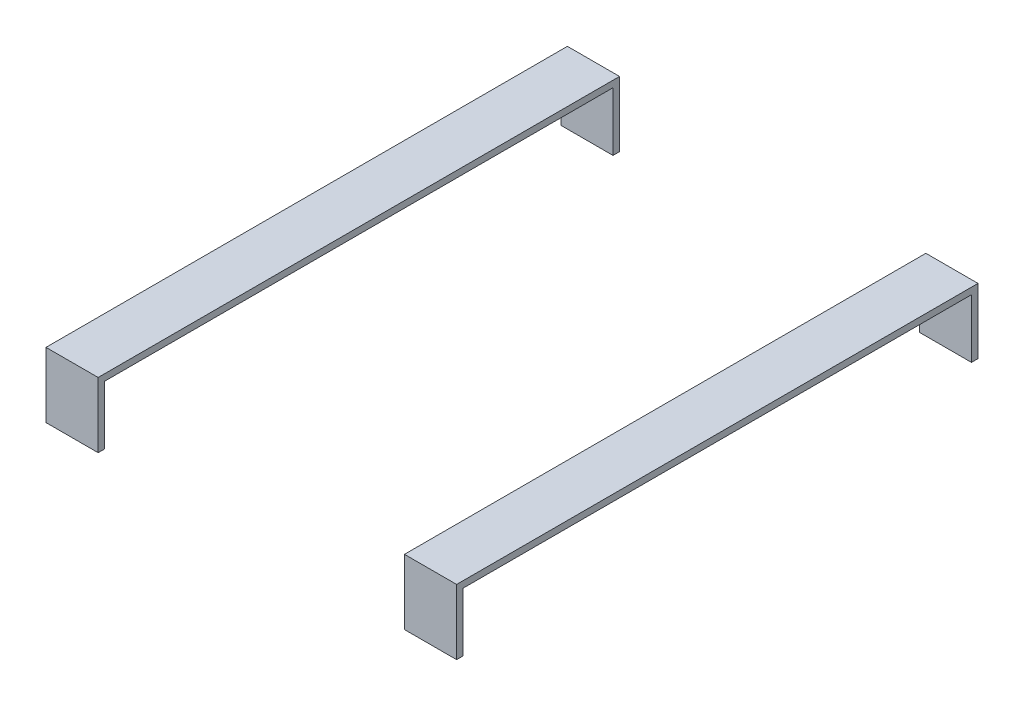
ISO-10303-21;
HEADER;
FILE_DESCRIPTION(('STEP AP214'),'2;1');
FILE_NAME('part.step','',(''),(''),'','','');
FILE_SCHEMA(('AUTOMOTIVE_DESIGN { 1 0 10303 214 1 1 1 1 }'));
ENDSEC;
DATA;
#1=APPLICATION_CONTEXT('core data for automotive mechanical design processes');
#2=APPLICATION_PROTOCOL_DEFINITION('international standard','automotive_design',2000,#1);
#3=PRODUCT_CONTEXT('',#1,'mechanical');
#4=PRODUCT('Part','Part','',(#3));
#5=PRODUCT_RELATED_PRODUCT_CATEGORY('part','',(#4));
#6=PRODUCT_DEFINITION_FORMATION('','',#4);
#7=PRODUCT_DEFINITION_CONTEXT('part definition',#1,'design');
#8=PRODUCT_DEFINITION('design','',#6,#7);
#9=PRODUCT_DEFINITION_SHAPE('','',#8);
#10=(LENGTH_UNIT() NAMED_UNIT(*) SI_UNIT(.MILLI.,.METRE.));
#11=(NAMED_UNIT(*) PLANE_ANGLE_UNIT() SI_UNIT($,.RADIAN.));
#12=(NAMED_UNIT(*) SI_UNIT($,.STERADIAN.) SOLID_ANGLE_UNIT());
#13=UNCERTAINTY_MEASURE_WITH_UNIT(LENGTH_MEASURE(1.E-05),#10,'distance_accuracy_value','');
#14=(GEOMETRIC_REPRESENTATION_CONTEXT(3) GLOBAL_UNCERTAINTY_ASSIGNED_CONTEXT((#13)) GLOBAL_UNIT_ASSIGNED_CONTEXT((#10,
#11,#12)) REPRESENTATION_CONTEXT('',''));
#15=CARTESIAN_POINT('',(0.,0.,0.));
#16=DIRECTION('',(0.,0.,1.));
#17=DIRECTION('',(1.,0.,0.));
#18=AXIS2_PLACEMENT_3D('',#15,#16,#17);
#19=CARTESIAN_POINT('',(470.,100.,10.));
#20=DIRECTION('',(0.,0.,-1.));
#21=DIRECTION('',(-1.,0.,0.));
#22=AXIS2_PLACEMENT_3D('',#19,#20,#21);
#23=PLANE('',#22);
#24=DIRECTION('',(1.,0.,0.));
#25=VECTOR('',#24,1.);
#26=CARTESIAN_POINT('',(470.,90.,10.));
#27=LINE('',#26,#25);
#28=CARTESIAN_POINT('',(470.,90.,10.));
#29=VERTEX_POINT('',#28);
#30=CARTESIAN_POINT('',(550.,90.,10.));
#31=VERTEX_POINT('',#30);
#32=EDGE_CURVE('E60',#29,#31,#27,.T.);
#33=ORIENTED_EDGE('',*,*,#32,.F.);
#34=DIRECTION('',(0.,-1.,0.));
#35=VECTOR('',#34,1.);
#36=CARTESIAN_POINT('',(470.,100.,10.));
#37=LINE('',#36,#35);
#38=CARTESIAN_POINT('',(470.,0.,10.));
#39=VERTEX_POINT('',#38);
#40=EDGE_CURVE('E95',#29,#39,#37,.T.);
#41=ORIENTED_EDGE('',*,*,#40,.T.);
#42=DIRECTION('',(1.,0.,0.));
#43=VECTOR('',#42,1.);
#44=CARTESIAN_POINT('',(470.,0.,10.));
#45=LINE('',#44,#43);
#46=CARTESIAN_POINT('',(550.,0.,10.));
#47=VERTEX_POINT('',#46);
#48=EDGE_CURVE('E99',#39,#47,#45,.T.);
#49=ORIENTED_EDGE('',*,*,#48,.T.);
#50=DIRECTION('',(0.,-1.,0.));
#51=VECTOR('',#50,1.);
#52=CARTESIAN_POINT('',(550.,100.,10.));
#53=LINE('',#52,#51);
#54=EDGE_CURVE('E87',#31,#47,#53,.T.);
#55=ORIENTED_EDGE('',*,*,#54,.F.);
#56=EDGE_LOOP('',(#33,#41,#49,#55));
#57=FACE_BOUND('',#56,.T.);
#58=ADVANCED_FACE('F45',(#57),#23,.F.);
#59=CARTESIAN_POINT('',(550.,100.,0.));
#60=DIRECTION('',(-1.,0.,0.));
#61=DIRECTION('',(0.,0.,1.));
#62=AXIS2_PLACEMENT_3D('',#59,#60,#61);
#63=PLANE('',#62);
#64=DIRECTION('',(0.,0.,-1.));
#65=VECTOR('',#64,1.);
#66=CARTESIAN_POINT('',(550.,0.,0.));
#67=LINE('',#66,#65);
#68=CARTESIAN_POINT('',(550.,0.,0.));
#69=VERTEX_POINT('',#68);
#70=EDGE_CURVE('E91',#47,#69,#67,.T.);
#71=ORIENTED_EDGE('',*,*,#70,.T.);
#72=DIRECTION('',(0.,-1.,0.));
#73=VECTOR('',#72,1.);
#74=CARTESIAN_POINT('',(550.,100.,0.));
#75=LINE('',#74,#73);
#76=CARTESIAN_POINT('',(550.,100.,0.));
#77=VERTEX_POINT('',#76);
#78=EDGE_CURVE('E12',#77,#69,#75,.T.);
#79=ORIENTED_EDGE('',*,*,#78,.F.);
#80=DIRECTION('',(0.,0.,-1.));
#81=VECTOR('',#80,1.);
#82=CARTESIAN_POINT('',(550.,100.,0.));
#83=LINE('',#82,#81);
#84=CARTESIAN_POINT('',(550.,100.,800.));
#85=VERTEX_POINT('',#84);
#86=EDGE_CURVE('E103',#85,#77,#83,.T.);
#87=ORIENTED_EDGE('',*,*,#86,.F.);
#88=DIRECTION('',(0.,-1.,0.));
#89=VECTOR('',#88,1.);
#90=CARTESIAN_POINT('',(550.,100.,800.));
#91=LINE('',#90,#89);
#92=CARTESIAN_POINT('',(550.,0.,800.));
#93=VERTEX_POINT('',#92);
#94=EDGE_CURVE('E131',#85,#93,#91,.T.);
#95=ORIENTED_EDGE('',*,*,#94,.T.);
#96=DIRECTION('',(0.,0.,-1.));
#97=VECTOR('',#96,1.);
#98=CARTESIAN_POINT('',(550.,0.,800.));
#99=LINE('',#98,#97);
#100=CARTESIAN_POINT('',(550.,0.,790.));
#101=VERTEX_POINT('',#100);
#102=EDGE_CURVE('E179',#93,#101,#99,.T.);
#103=ORIENTED_EDGE('',*,*,#102,.T.);
#104=DIRECTION('',(0.,-1.,0.));
#105=VECTOR('',#104,1.);
#106=CARTESIAN_POINT('',(550.,100.,790.));
#107=LINE('',#106,#105);
#108=CARTESIAN_POINT('',(550.,90.,790.));
#109=VERTEX_POINT('',#108);
#110=EDGE_CURVE('E149',#109,#101,#107,.T.);
#111=ORIENTED_EDGE('',*,*,#110,.F.);
#112=DIRECTION('',(0.,0.,-1.));
#113=VECTOR('',#112,1.);
#114=CARTESIAN_POINT('',(550.,90.,870.622577482985));
#115=LINE('',#114,#113);
#116=EDGE_CURVE('E94',#109,#31,#115,.T.);
#117=ORIENTED_EDGE('',*,*,#116,.T.);
#118=ORIENTED_EDGE('',*,*,#54,.T.);
#119=EDGE_LOOP('',(#71,#79,#87,#95,#103,#111,#117,#118));
#120=FACE_BOUND('',#119,.T.);
#121=ADVANCED_FACE('F47',(#120),#63,.F.);
#122=CARTESIAN_POINT('',(470.,100.,0.));
#123=DIRECTION('',(0.,0.,1.));
#124=DIRECTION('',(1.,0.,0.));
#125=AXIS2_PLACEMENT_3D('',#122,#123,#124);
#126=PLANE('',#125);
#127=DIRECTION('',(-1.,0.,0.));
#128=VECTOR('',#127,1.);
#129=CARTESIAN_POINT('',(470.,0.,0.));
#130=LINE('',#129,#128);
#131=CARTESIAN_POINT('',(470.,0.,0.));
#132=VERTEX_POINT('',#131);
#133=EDGE_CURVE('E107',#69,#132,#130,.T.);
#134=ORIENTED_EDGE('',*,*,#133,.T.);
#135=DIRECTION('',(0.,-1.,0.));
#136=VECTOR('',#135,1.);
#137=CARTESIAN_POINT('',(470.,100.,0.));
#138=LINE('',#137,#136);
#139=CARTESIAN_POINT('',(470.,100.,0.));
#140=VERTEX_POINT('',#139);
#141=EDGE_CURVE('E53',#140,#132,#138,.T.);
#142=ORIENTED_EDGE('',*,*,#141,.F.);
#143=DIRECTION('',(-1.,0.,0.));
#144=VECTOR('',#143,1.);
#145=CARTESIAN_POINT('',(470.,100.,0.));
#146=LINE('',#145,#144);
#147=EDGE_CURVE('E69',#77,#140,#146,.T.);
#148=ORIENTED_EDGE('',*,*,#147,.F.);
#149=ORIENTED_EDGE('',*,*,#78,.T.);
#150=EDGE_LOOP('',(#134,#142,#148,#149));
#151=FACE_BOUND('',#150,.T.);
#152=ADVANCED_FACE('F123',(#151),#126,.F.);
#153=CARTESIAN_POINT('',(470.,100.,0.));
#154=DIRECTION('',(1.,0.,0.));
#155=DIRECTION('',(0.,0.,-1.));
#156=AXIS2_PLACEMENT_3D('',#153,#154,#155);
#157=PLANE('',#156);
#158=DIRECTION('',(0.,0.,1.));
#159=VECTOR('',#158,1.);
#160=CARTESIAN_POINT('',(470.,0.,0.));
#161=LINE('',#160,#159);
#162=EDGE_CURVE('E104',#132,#39,#161,.T.);
#163=ORIENTED_EDGE('',*,*,#162,.T.);
#164=ORIENTED_EDGE('',*,*,#40,.F.);
#165=DIRECTION('',(0.,0.,-1.));
#166=VECTOR('',#165,1.);
#167=CARTESIAN_POINT('',(470.,90.,870.622577482985));
#168=LINE('',#167,#166);
#169=CARTESIAN_POINT('',(470.,90.,790.));
#170=VERTEX_POINT('',#169);
#171=EDGE_CURVE('E148',#170,#29,#168,.T.);
#172=ORIENTED_EDGE('',*,*,#171,.F.);
#173=DIRECTION('',(0.,-1.,0.));
#174=VECTOR('',#173,1.);
#175=CARTESIAN_POINT('',(470.,100.,790.));
#176=LINE('',#175,#174);
#177=CARTESIAN_POINT('',(470.,0.,790.));
#178=VERTEX_POINT('',#177);
#179=EDGE_CURVE('E154',#170,#178,#176,.T.);
#180=ORIENTED_EDGE('',*,*,#179,.T.);
#181=DIRECTION('',(0.,0.,1.));
#182=VECTOR('',#181,1.);
#183=CARTESIAN_POINT('',(470.,0.,800.));
#184=LINE('',#183,#182);
#185=CARTESIAN_POINT('',(470.,0.,800.));
#186=VERTEX_POINT('',#185);
#187=EDGE_CURVE('E143',#178,#186,#184,.T.);
#188=ORIENTED_EDGE('',*,*,#187,.T.);
#189=DIRECTION('',(0.,-1.,0.));
#190=VECTOR('',#189,1.);
#191=CARTESIAN_POINT('',(470.,100.,800.));
#192=LINE('',#191,#190);
#193=CARTESIAN_POINT('',(470.,100.,800.));
#194=VERTEX_POINT('',#193);
#195=EDGE_CURVE('E142',#194,#186,#192,.T.);
#196=ORIENTED_EDGE('',*,*,#195,.F.);
#197=DIRECTION('',(0.,0.,1.));
#198=VECTOR('',#197,1.);
#199=CARTESIAN_POINT('',(470.,100.,0.));
#200=LINE('',#199,#198);
#201=EDGE_CURVE('E96',#140,#194,#200,.T.);
#202=ORIENTED_EDGE('',*,*,#201,.F.);
#203=ORIENTED_EDGE('',*,*,#141,.T.);
#204=EDGE_LOOP('',(#163,#164,#172,#180,#188,#196,#202,#203));
#205=FACE_BOUND('',#204,.T.);
#206=ADVANCED_FACE('F120',(#205),#157,.F.);
#207=CARTESIAN_POINT('',(0.,100.,0.));
#208=DIRECTION('',(0.,1.,0.));
#209=DIRECTION('',(0.,0.,1.));
#210=AXIS2_PLACEMENT_3D('',#207,#208,#209);
#211=PLANE('',#210);
#212=ORIENTED_EDGE('',*,*,#86,.T.);
#213=ORIENTED_EDGE('',*,*,#147,.T.);
#214=ORIENTED_EDGE('',*,*,#201,.T.);
#215=DIRECTION('',(1.,0.,0.));
#216=VECTOR('',#215,1.);
#217=CARTESIAN_POINT('',(470.,100.,800.));
#218=LINE('',#217,#216);
#219=EDGE_CURVE('E138',#194,#85,#218,.T.);
#220=ORIENTED_EDGE('',*,*,#219,.T.);
#221=EDGE_LOOP('',(#212,#213,#214,#220));
#222=FACE_BOUND('',#221,.T.);
#223=ADVANCED_FACE('F139',(#222),#211,.T.);
#224=CARTESIAN_POINT('',(0.,0.,0.));
#225=DIRECTION('',(0.,1.,0.));
#226=DIRECTION('',(0.,0.,1.));
#227=AXIS2_PLACEMENT_3D('',#224,#225,#226);
#228=PLANE('',#227);
#229=ORIENTED_EDGE('',*,*,#70,.F.);
#230=ORIENTED_EDGE('',*,*,#48,.F.);
#231=ORIENTED_EDGE('',*,*,#162,.F.);
#232=ORIENTED_EDGE('',*,*,#133,.F.);
#233=EDGE_LOOP('',(#229,#230,#231,#232));
#234=FACE_BOUND('',#233,.T.);
#235=ADVANCED_FACE('F106',(#234),#228,.F.);
#236=CARTESIAN_POINT('',(470.,90.,870.622577482985));
#237=DIRECTION('',(0.,1.,0.));
#238=DIRECTION('',(-1.,0.,0.));
#239=AXIS2_PLACEMENT_3D('',#236,#237,#238);
#240=PLANE('',#239);
#241=DIRECTION('',(1.,0.,0.));
#242=VECTOR('',#241,1.);
#243=CARTESIAN_POINT('',(470.,90.,790.));
#244=LINE('',#243,#242);
#245=EDGE_CURVE('E108',#170,#109,#244,.T.);
#246=ORIENTED_EDGE('',*,*,#245,.F.);
#247=ORIENTED_EDGE('',*,*,#171,.T.);
#248=ORIENTED_EDGE('',*,*,#32,.T.);
#249=ORIENTED_EDGE('',*,*,#116,.F.);
#250=EDGE_LOOP('',(#246,#247,#248,#249));
#251=FACE_BOUND('',#250,.T.);
#252=ADVANCED_FACE('F161',(#251),#240,.F.);
#253=CARTESIAN_POINT('',(470.,100.,790.));
#254=DIRECTION('',(0.,0.,1.));
#255=DIRECTION('',(1.,0.,0.));
#256=AXIS2_PLACEMENT_3D('',#253,#254,#255);
#257=PLANE('',#256);
#258=ORIENTED_EDGE('',*,*,#179,.F.);
#259=ORIENTED_EDGE('',*,*,#245,.T.);
#260=ORIENTED_EDGE('',*,*,#110,.T.);
#261=DIRECTION('',(-1.,0.,0.));
#262=VECTOR('',#261,1.);
#263=CARTESIAN_POINT('',(470.,0.,790.));
#264=LINE('',#263,#262);
#265=EDGE_CURVE('E183',#101,#178,#264,.T.);
#266=ORIENTED_EDGE('',*,*,#265,.T.);
#267=EDGE_LOOP('',(#258,#259,#260,#266));
#268=FACE_BOUND('',#267,.T.);
#269=ADVANCED_FACE('F191',(#268),#257,.F.);
#270=CARTESIAN_POINT('',(470.,100.,800.));
#271=DIRECTION('',(0.,0.,-1.));
#272=DIRECTION('',(-1.,0.,0.));
#273=AXIS2_PLACEMENT_3D('',#270,#271,#272);
#274=PLANE('',#273);
#275=DIRECTION('',(1.,0.,0.));
#276=VECTOR('',#275,1.);
#277=CARTESIAN_POINT('',(470.,0.,800.));
#278=LINE('',#277,#276);
#279=EDGE_CURVE('E147',#186,#93,#278,.T.);
#280=ORIENTED_EDGE('',*,*,#279,.T.);
#281=ORIENTED_EDGE('',*,*,#94,.F.);
#282=ORIENTED_EDGE('',*,*,#219,.F.);
#283=ORIENTED_EDGE('',*,*,#195,.T.);
#284=EDGE_LOOP('',(#280,#281,#282,#283));
#285=FACE_BOUND('',#284,.T.);
#286=ADVANCED_FACE('F145',(#285),#274,.F.);
#287=CARTESIAN_POINT('',(0.,0.,0.));
#288=DIRECTION('',(0.,1.,0.));
#289=DIRECTION('',(0.,0.,1.));
#290=AXIS2_PLACEMENT_3D('',#287,#288,#289);
#291=PLANE('',#290);
#292=ORIENTED_EDGE('',*,*,#279,.F.);
#293=ORIENTED_EDGE('',*,*,#187,.F.);
#294=ORIENTED_EDGE('',*,*,#265,.F.);
#295=ORIENTED_EDGE('',*,*,#102,.F.);
#296=EDGE_LOOP('',(#292,#293,#294,#295));
#297=FACE_BOUND('',#296,.T.);
#298=ADVANCED_FACE('F180',(#297),#291,.F.);
#299=CLOSED_SHELL('',(#58,#121,#152,#206,#223,#235,#252,#269,#286,#298));
#300=MANIFOLD_SOLID_BREP('B2',#299);
#301=CARTESIAN_POINT('',(0.,100.,10.));
#302=DIRECTION('',(0.,0.,-1.));
#303=DIRECTION('',(-1.,0.,0.));
#304=AXIS2_PLACEMENT_3D('',#301,#302,#303);
#305=PLANE('',#304);
#306=DIRECTION('',(1.,0.,0.));
#307=VECTOR('',#306,1.);
#308=CARTESIAN_POINT('',(-80.,90.,10.));
#309=LINE('',#308,#307);
#310=CARTESIAN_POINT('',(-80.,90.,10.));
#311=VERTEX_POINT('',#310);
#312=CARTESIAN_POINT('',(0.,90.,10.));
#313=VERTEX_POINT('',#312);
#314=EDGE_CURVE('E306',#311,#313,#309,.T.);
#315=ORIENTED_EDGE('',*,*,#314,.F.);
#316=DIRECTION('',(0.,-1.,0.));
#317=VECTOR('',#316,1.);
#318=CARTESIAN_POINT('',(-80.,100.,10.));
#319=LINE('',#318,#317);
#320=CARTESIAN_POINT('',(-80.,0.,10.));
#321=VERTEX_POINT('',#320);
#322=EDGE_CURVE('E341',#311,#321,#319,.T.);
#323=ORIENTED_EDGE('',*,*,#322,.T.);
#324=DIRECTION('',(1.,0.,0.));
#325=VECTOR('',#324,1.);
#326=CARTESIAN_POINT('',(0.,0.,10.));
#327=LINE('',#326,#325);
#328=CARTESIAN_POINT('',(0.,0.,10.));
#329=VERTEX_POINT('',#328);
#330=EDGE_CURVE('E345',#321,#329,#327,.T.);
#331=ORIENTED_EDGE('',*,*,#330,.T.);
#332=DIRECTION('',(0.,-1.,0.));
#333=VECTOR('',#332,1.);
#334=CARTESIAN_POINT('',(0.,100.,10.));
#335=LINE('',#334,#333);
#336=EDGE_CURVE('E333',#313,#329,#335,.T.);
#337=ORIENTED_EDGE('',*,*,#336,.F.);
#338=EDGE_LOOP('',(#315,#323,#331,#337));
#339=FACE_BOUND('',#338,.T.);
#340=ADVANCED_FACE('F291',(#339),#305,.F.);
#341=CARTESIAN_POINT('',(0.,100.,0.));
#342=DIRECTION('',(-1.,0.,0.));
#343=DIRECTION('',(0.,0.,1.));
#344=AXIS2_PLACEMENT_3D('',#341,#342,#343);
#345=PLANE('',#344);
#346=DIRECTION('',(0.,0.,-1.));
#347=VECTOR('',#346,1.);
#348=CARTESIAN_POINT('',(0.,0.,0.));
#349=LINE('',#348,#347);
#350=CARTESIAN_POINT('',(0.,0.,0.));
#351=VERTEX_POINT('',#350);
#352=EDGE_CURVE('E337',#329,#351,#349,.T.);
#353=ORIENTED_EDGE('',*,*,#352,.T.);
#354=DIRECTION('',(0.,-1.,0.));
#355=VECTOR('',#354,1.);
#356=CARTESIAN_POINT('',(0.,100.,0.));
#357=LINE('',#356,#355);
#358=CARTESIAN_POINT('',(0.,100.,0.));
#359=VERTEX_POINT('',#358);
#360=EDGE_CURVE('E43',#359,#351,#357,.T.);
#361=ORIENTED_EDGE('',*,*,#360,.F.);
#362=DIRECTION('',(0.,0.,-1.));
#363=VECTOR('',#362,1.);
#364=CARTESIAN_POINT('',(0.,100.,0.));
#365=LINE('',#364,#363);
#366=CARTESIAN_POINT('',(0.,100.,800.));
#367=VERTEX_POINT('',#366);
#368=EDGE_CURVE('E349',#367,#359,#365,.T.);
#369=ORIENTED_EDGE('',*,*,#368,.F.);
#370=DIRECTION('',(0.,-1.,0.));
#371=VECTOR('',#370,1.);
#372=CARTESIAN_POINT('',(0.,100.,800.));
#373=LINE('',#372,#371);
#374=CARTESIAN_POINT('',(0.,0.,800.));
#375=VERTEX_POINT('',#374);
#376=EDGE_CURVE('E377',#367,#375,#373,.T.);
#377=ORIENTED_EDGE('',*,*,#376,.T.);
#378=DIRECTION('',(0.,0.,-1.));
#379=VECTOR('',#378,1.);
#380=CARTESIAN_POINT('',(0.,0.,800.));
#381=LINE('',#380,#379);
#382=CARTESIAN_POINT('',(0.,0.,790.));
#383=VERTEX_POINT('',#382);
#384=EDGE_CURVE('E425',#375,#383,#381,.T.);
#385=ORIENTED_EDGE('',*,*,#384,.T.);
#386=DIRECTION('',(0.,-1.,0.));
#387=VECTOR('',#386,1.);
#388=CARTESIAN_POINT('',(0.,100.,790.));
#389=LINE('',#388,#387);
#390=CARTESIAN_POINT('',(0.,90.,790.));
#391=VERTEX_POINT('',#390);
#392=EDGE_CURVE('E395',#391,#383,#389,.T.);
#393=ORIENTED_EDGE('',*,*,#392,.F.);
#394=DIRECTION('',(0.,0.,-1.));
#395=VECTOR('',#394,1.);
#396=CARTESIAN_POINT('',(0.,90.,870.622577482985));
#397=LINE('',#396,#395);
#398=EDGE_CURVE('E340',#391,#313,#397,.T.);
#399=ORIENTED_EDGE('',*,*,#398,.T.);
#400=ORIENTED_EDGE('',*,*,#336,.T.);
#401=EDGE_LOOP('',(#353,#361,#369,#377,#385,#393,#399,#400));
#402=FACE_BOUND('',#401,.T.);
#403=ADVANCED_FACE('F293',(#402),#345,.F.);
#404=CARTESIAN_POINT('',(0.,100.,0.));
#405=DIRECTION('',(0.,0.,1.));
#406=DIRECTION('',(1.,0.,0.));
#407=AXIS2_PLACEMENT_3D('',#404,#405,#406);
#408=PLANE('',#407);
#409=DIRECTION('',(-1.,0.,0.));
#410=VECTOR('',#409,1.);
#411=CARTESIAN_POINT('',(0.,0.,0.));
#412=LINE('',#411,#410);
#413=CARTESIAN_POINT('',(-80.,0.,0.));
#414=VERTEX_POINT('',#413);
#415=EDGE_CURVE('E353',#351,#414,#412,.T.);
#416=ORIENTED_EDGE('',*,*,#415,.T.);
#417=DIRECTION('',(0.,-1.,0.));
#418=VECTOR('',#417,1.);
#419=CARTESIAN_POINT('',(-80.,100.,0.));
#420=LINE('',#419,#418);
#421=CARTESIAN_POINT('',(-80.,100.,0.));
#422=VERTEX_POINT('',#421);
#423=EDGE_CURVE('E299',#422,#414,#420,.T.);
#424=ORIENTED_EDGE('',*,*,#423,.F.);
#425=DIRECTION('',(-1.,0.,0.));
#426=VECTOR('',#425,1.);
#427=CARTESIAN_POINT('',(0.,100.,0.));
#428=LINE('',#427,#426);
#429=EDGE_CURVE('E315',#359,#422,#428,.T.);
#430=ORIENTED_EDGE('',*,*,#429,.F.);
#431=ORIENTED_EDGE('',*,*,#360,.T.);
#432=EDGE_LOOP('',(#416,#424,#430,#431));
#433=FACE_BOUND('',#432,.T.);
#434=ADVANCED_FACE('F369',(#433),#408,.F.);
#435=CARTESIAN_POINT('',(-80.,100.,0.));
#436=DIRECTION('',(1.,0.,0.));
#437=DIRECTION('',(0.,0.,-1.));
#438=AXIS2_PLACEMENT_3D('',#435,#436,#437);
#439=PLANE('',#438);
#440=DIRECTION('',(0.,0.,1.));
#441=VECTOR('',#440,1.);
#442=CARTESIAN_POINT('',(-80.,0.,0.));
#443=LINE('',#442,#441);
#444=EDGE_CURVE('E350',#414,#321,#443,.T.);
#445=ORIENTED_EDGE('',*,*,#444,.T.);
#446=ORIENTED_EDGE('',*,*,#322,.F.);
#447=DIRECTION('',(0.,0.,-1.));
#448=VECTOR('',#447,1.);
#449=CARTESIAN_POINT('',(-80.,90.,870.622577482985));
#450=LINE('',#449,#448);
#451=CARTESIAN_POINT('',(-80.,90.,790.));
#452=VERTEX_POINT('',#451);
#453=EDGE_CURVE('E394',#452,#311,#450,.T.);
#454=ORIENTED_EDGE('',*,*,#453,.F.);
#455=DIRECTION('',(0.,-1.,0.));
#456=VECTOR('',#455,1.);
#457=CARTESIAN_POINT('',(-80.,100.,790.));
#458=LINE('',#457,#456);
#459=CARTESIAN_POINT('',(-80.,0.,790.));
#460=VERTEX_POINT('',#459);
#461=EDGE_CURVE('E400',#452,#460,#458,.T.);
#462=ORIENTED_EDGE('',*,*,#461,.T.);
#463=DIRECTION('',(0.,0.,1.));
#464=VECTOR('',#463,1.);
#465=CARTESIAN_POINT('',(-80.,0.,800.));
#466=LINE('',#465,#464);
#467=CARTESIAN_POINT('',(-80.,0.,800.));
#468=VERTEX_POINT('',#467);
#469=EDGE_CURVE('E389',#460,#468,#466,.T.);
#470=ORIENTED_EDGE('',*,*,#469,.T.);
#471=DIRECTION('',(0.,-1.,0.));
#472=VECTOR('',#471,1.);
#473=CARTESIAN_POINT('',(-80.,100.,800.));
#474=LINE('',#473,#472);
#475=CARTESIAN_POINT('',(-80.,100.,800.));
#476=VERTEX_POINT('',#475);
#477=EDGE_CURVE('E388',#476,#468,#474,.T.);
#478=ORIENTED_EDGE('',*,*,#477,.F.);
#479=DIRECTION('',(0.,0.,1.));
#480=VECTOR('',#479,1.);
#481=CARTESIAN_POINT('',(-80.,100.,0.));
#482=LINE('',#481,#480);
#483=EDGE_CURVE('E342',#422,#476,#482,.T.);
#484=ORIENTED_EDGE('',*,*,#483,.F.);
#485=ORIENTED_EDGE('',*,*,#423,.T.);
#486=EDGE_LOOP('',(#445,#446,#454,#462,#470,#478,#484,#485));
#487=FACE_BOUND('',#486,.T.);
#488=ADVANCED_FACE('F366',(#487),#439,.F.);
#489=CARTESIAN_POINT('',(0.,100.,0.));
#490=DIRECTION('',(0.,-1.,0.));
#491=DIRECTION('',(0.,0.,-1.));
#492=AXIS2_PLACEMENT_3D('',#489,#490,#491);
#493=PLANE('',#492);
#494=ORIENTED_EDGE('',*,*,#368,.T.);
#495=ORIENTED_EDGE('',*,*,#429,.T.);
#496=ORIENTED_EDGE('',*,*,#483,.T.);
#497=DIRECTION('',(1.,0.,0.));
#498=VECTOR('',#497,1.);
#499=CARTESIAN_POINT('',(0.,100.,800.));
#500=LINE('',#499,#498);
#501=EDGE_CURVE('E384',#476,#367,#500,.T.);
#502=ORIENTED_EDGE('',*,*,#501,.T.);
#503=EDGE_LOOP('',(#494,#495,#496,#502));
#504=FACE_BOUND('',#503,.T.);
#505=ADVANCED_FACE('F385',(#504),#493,.F.);
#506=CARTESIAN_POINT('',(0.,0.,0.));
#507=DIRECTION('',(0.,-1.,0.));
#508=DIRECTION('',(0.,0.,-1.));
#509=AXIS2_PLACEMENT_3D('',#506,#507,#508);
#510=PLANE('',#509);
#511=ORIENTED_EDGE('',*,*,#352,.F.);
#512=ORIENTED_EDGE('',*,*,#330,.F.);
#513=ORIENTED_EDGE('',*,*,#444,.F.);
#514=ORIENTED_EDGE('',*,*,#415,.F.);
#515=EDGE_LOOP('',(#511,#512,#513,#514));
#516=FACE_BOUND('',#515,.T.);
#517=ADVANCED_FACE('F352',(#516),#510,.T.);
#518=CARTESIAN_POINT('',(-80.,90.,870.622577482985));
#519=DIRECTION('',(0.,1.,0.));
#520=DIRECTION('',(0.,0.,1.));
#521=AXIS2_PLACEMENT_3D('',#518,#519,#520);
#522=PLANE('',#521);
#523=DIRECTION('',(1.,0.,0.));
#524=VECTOR('',#523,1.);
#525=CARTESIAN_POINT('',(-80.,90.,790.));
#526=LINE('',#525,#524);
#527=EDGE_CURVE('E354',#452,#391,#526,.T.);
#528=ORIENTED_EDGE('',*,*,#527,.F.);
#529=ORIENTED_EDGE('',*,*,#453,.T.);
#530=ORIENTED_EDGE('',*,*,#314,.T.);
#531=ORIENTED_EDGE('',*,*,#398,.F.);
#532=EDGE_LOOP('',(#528,#529,#530,#531));
#533=FACE_BOUND('',#532,.T.);
#534=ADVANCED_FACE('F407',(#533),#522,.F.);
#535=CARTESIAN_POINT('',(0.,100.,790.));
#536=DIRECTION('',(0.,0.,1.));
#537=DIRECTION('',(1.,0.,0.));
#538=AXIS2_PLACEMENT_3D('',#535,#536,#537);
#539=PLANE('',#538);
#540=ORIENTED_EDGE('',*,*,#461,.F.);
#541=ORIENTED_EDGE('',*,*,#527,.T.);
#542=ORIENTED_EDGE('',*,*,#392,.T.);
#543=DIRECTION('',(-1.,0.,0.));
#544=VECTOR('',#543,1.);
#545=CARTESIAN_POINT('',(0.,0.,790.));
#546=LINE('',#545,#544);
#547=EDGE_CURVE('E429',#383,#460,#546,.T.);
#548=ORIENTED_EDGE('',*,*,#547,.T.);
#549=EDGE_LOOP('',(#540,#541,#542,#548));
#550=FACE_BOUND('',#549,.T.);
#551=ADVANCED_FACE('F437',(#550),#539,.F.);
#552=CARTESIAN_POINT('',(0.,100.,800.));
#553=DIRECTION('',(0.,0.,-1.));
#554=DIRECTION('',(-1.,0.,0.));
#555=AXIS2_PLACEMENT_3D('',#552,#553,#554);
#556=PLANE('',#555);
#557=DIRECTION('',(1.,0.,0.));
#558=VECTOR('',#557,1.);
#559=CARTESIAN_POINT('',(0.,0.,800.));
#560=LINE('',#559,#558);
#561=EDGE_CURVE('E393',#468,#375,#560,.T.);
#562=ORIENTED_EDGE('',*,*,#561,.T.);
#563=ORIENTED_EDGE('',*,*,#376,.F.);
#564=ORIENTED_EDGE('',*,*,#501,.F.);
#565=ORIENTED_EDGE('',*,*,#477,.T.);
#566=EDGE_LOOP('',(#562,#563,#564,#565));
#567=FACE_BOUND('',#566,.T.);
#568=ADVANCED_FACE('F391',(#567),#556,.F.);
#569=CARTESIAN_POINT('',(0.,0.,0.));
#570=DIRECTION('',(0.,-1.,0.));
#571=DIRECTION('',(0.,0.,-1.));
#572=AXIS2_PLACEMENT_3D('',#569,#570,#571);
#573=PLANE('',#572);
#574=ORIENTED_EDGE('',*,*,#561,.F.);
#575=ORIENTED_EDGE('',*,*,#469,.F.);
#576=ORIENTED_EDGE('',*,*,#547,.F.);
#577=ORIENTED_EDGE('',*,*,#384,.F.);
#578=EDGE_LOOP('',(#574,#575,#576,#577));
#579=FACE_BOUND('',#578,.T.);
#580=ADVANCED_FACE('F426',(#579),#573,.T.);
#581=CLOSED_SHELL('',(#340,#403,#434,#488,#505,#517,#534,#551,#568,#580));
#582=MANIFOLD_SOLID_BREP('B6',#581);
#583=ADVANCED_BREP_SHAPE_REPRESENTATION('',(#18,#300,#582),#14);
#584=SHAPE_DEFINITION_REPRESENTATION(#9,#583);
ENDSEC;
END-ISO-10303-21;
